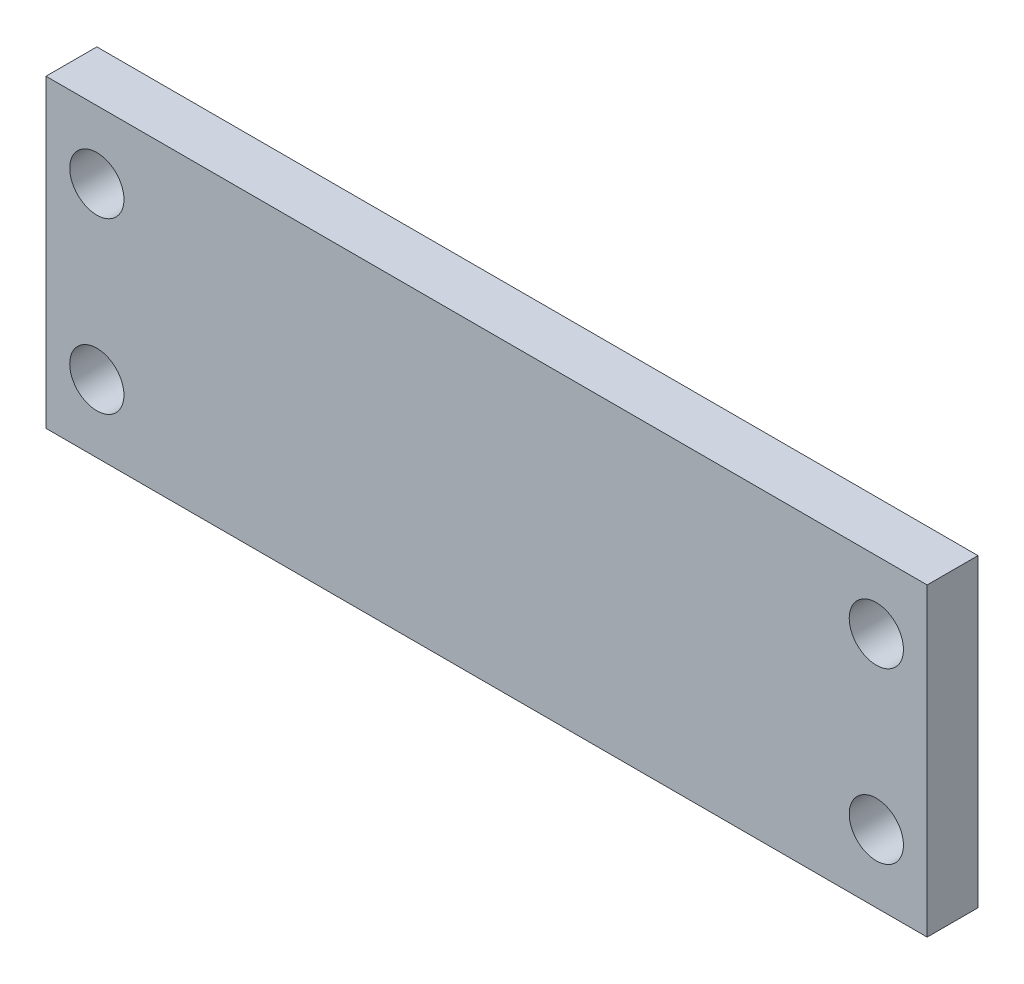
ISO-10303-21;
HEADER;
FILE_DESCRIPTION(('STEP AP214'),'2;1');
FILE_NAME('part.step','',(''),(''),'','','');
FILE_SCHEMA(('AUTOMOTIVE_DESIGN { 1 0 10303 214 1 1 1 1 }'));
ENDSEC;
DATA;
#1=APPLICATION_CONTEXT('core data for automotive mechanical design processes');
#2=APPLICATION_PROTOCOL_DEFINITION('international standard','automotive_design',2000,#1);
#3=PRODUCT_CONTEXT('',#1,'mechanical');
#4=PRODUCT('Part','Part','',(#3));
#5=PRODUCT_RELATED_PRODUCT_CATEGORY('part','',(#4));
#6=PRODUCT_DEFINITION_FORMATION('','',#4);
#7=PRODUCT_DEFINITION_CONTEXT('part definition',#1,'design');
#8=PRODUCT_DEFINITION('design','',#6,#7);
#9=PRODUCT_DEFINITION_SHAPE('','',#8);
#10=(LENGTH_UNIT() NAMED_UNIT(*) SI_UNIT(.MILLI.,.METRE.));
#11=(NAMED_UNIT(*) PLANE_ANGLE_UNIT() SI_UNIT($,.RADIAN.));
#12=(NAMED_UNIT(*) SI_UNIT($,.STERADIAN.) SOLID_ANGLE_UNIT());
#13=UNCERTAINTY_MEASURE_WITH_UNIT(LENGTH_MEASURE(1.E-05),#10,'distance_accuracy_value','');
#14=(GEOMETRIC_REPRESENTATION_CONTEXT(3) GLOBAL_UNCERTAINTY_ASSIGNED_CONTEXT((#13)) GLOBAL_UNIT_ASSIGNED_CONTEXT((#10,
#11,#12)) REPRESENTATION_CONTEXT('',''));
#15=CARTESIAN_POINT('',(0.,0.,0.));
#16=DIRECTION('',(0.,0.,1.));
#17=DIRECTION('',(1.,0.,0.));
#18=AXIS2_PLACEMENT_3D('',#15,#16,#17);
#19=CARTESIAN_POINT('',(0.,0.,3.));
#20=DIRECTION('',(0.,0.,-1.));
#21=DIRECTION('',(-1.,0.,0.));
#22=AXIS2_PLACEMENT_3D('',#19,#20,#21);
#23=PLANE('',#22);
#24=DIRECTION('',(0.,1.,0.));
#25=VECTOR('',#24,1.);
#26=CARTESIAN_POINT('',(26.,-9.,3.));
#27=LINE('',#26,#25);
#28=CARTESIAN_POINT('',(26.,-9.,3.));
#29=VERTEX_POINT('',#28);
#30=CARTESIAN_POINT('',(26.,9.,3.));
#31=VERTEX_POINT('',#30);
#32=EDGE_CURVE('E92',#29,#31,#27,.T.);
#33=ORIENTED_EDGE('',*,*,#32,.T.);
#34=DIRECTION('',(-1.,0.,0.));
#35=VECTOR('',#34,1.);
#36=CARTESIAN_POINT('',(-26.,9.,3.));
#37=LINE('',#36,#35);
#38=CARTESIAN_POINT('',(-26.,9.,3.));
#39=VERTEX_POINT('',#38);
#40=EDGE_CURVE('E87',#31,#39,#37,.T.);
#41=ORIENTED_EDGE('',*,*,#40,.T.);
#42=DIRECTION('',(0.,-1.,0.));
#43=VECTOR('',#42,1.);
#44=CARTESIAN_POINT('',(-26.,-9.,3.));
#45=LINE('',#44,#43);
#46=CARTESIAN_POINT('',(-26.,-9.,3.));
#47=VERTEX_POINT('',#46);
#48=EDGE_CURVE('E90',#39,#47,#45,.T.);
#49=ORIENTED_EDGE('',*,*,#48,.T.);
#50=DIRECTION('',(1.,0.,0.));
#51=VECTOR('',#50,1.);
#52=CARTESIAN_POINT('',(-26.,-9.,3.));
#53=LINE('',#52,#51);
#54=EDGE_CURVE('E57',#47,#29,#53,.T.);
#55=ORIENTED_EDGE('',*,*,#54,.T.);
#56=EDGE_LOOP('',(#33,#41,#49,#55));
#57=FACE_BOUND('',#56,.T.);
#58=CARTESIAN_POINT('',(23.,-4.99999999999999,3.));
#59=DIRECTION('',(0.,0.,1.));
#60=DIRECTION('',(1.,0.,0.));
#61=AXIS2_PLACEMENT_3D('',#58,#59,#60);
#62=CIRCLE('',#61,1.6);
#63=CARTESIAN_POINT('',(24.6,-4.99999999999999,3.));
#64=VERTEX_POINT('',#63);
#65=EDGE_CURVE('E112',#64,#64,#62,.T.);
#66=ORIENTED_EDGE('',*,*,#65,.F.);
#67=EDGE_LOOP('',(#66));
#68=FACE_BOUND('',#67,.T.);
#69=CARTESIAN_POINT('',(-23.,5.,3.));
#70=DIRECTION('',(0.,0.,1.));
#71=DIRECTION('',(1.,0.,0.));
#72=AXIS2_PLACEMENT_3D('',#69,#70,#71);
#73=CIRCLE('',#72,1.6);
#74=CARTESIAN_POINT('',(-21.4,5.,3.));
#75=VERTEX_POINT('',#74);
#76=EDGE_CURVE('E134',#75,#75,#73,.T.);
#77=ORIENTED_EDGE('',*,*,#76,.F.);
#78=EDGE_LOOP('',(#77));
#79=FACE_BOUND('',#78,.T.);
#80=CARTESIAN_POINT('',(23.,5.00000000000001,3.));
#81=DIRECTION('',(0.,0.,1.));
#82=DIRECTION('',(-1.,0.,0.));
#83=AXIS2_PLACEMENT_3D('',#80,#81,#82);
#84=CIRCLE('',#83,1.6);
#85=CARTESIAN_POINT('',(21.4,5.00000000000001,3.));
#86=VERTEX_POINT('',#85);
#87=EDGE_CURVE('E142',#86,#86,#84,.T.);
#88=ORIENTED_EDGE('',*,*,#87,.F.);
#89=EDGE_LOOP('',(#88));
#90=FACE_BOUND('',#89,.T.);
#91=CARTESIAN_POINT('',(-23.,-5.,3.));
#92=DIRECTION('',(0.,0.,1.));
#93=DIRECTION('',(-1.,0.,0.));
#94=AXIS2_PLACEMENT_3D('',#91,#92,#93);
#95=CIRCLE('',#94,1.6);
#96=CARTESIAN_POINT('',(-24.6,-5.,3.));
#97=VERTEX_POINT('',#96);
#98=EDGE_CURVE('E150',#97,#97,#95,.T.);
#99=ORIENTED_EDGE('',*,*,#98,.F.);
#100=EDGE_LOOP('',(#99));
#101=FACE_BOUND('',#100,.T.);
#102=ADVANCED_FACE('F39',(#57,#68,#79,#90,#101),#23,.F.);
#103=CARTESIAN_POINT('',(0.,0.,0.));
#104=DIRECTION('',(0.,0.,-1.));
#105=DIRECTION('',(-1.,0.,0.));
#106=AXIS2_PLACEMENT_3D('',#103,#104,#105);
#107=PLANE('',#106);
#108=CARTESIAN_POINT('',(23.,5.00000000000001,0.));
#109=DIRECTION('',(0.,0.,1.));
#110=DIRECTION('',(-1.,0.,0.));
#111=AXIS2_PLACEMENT_3D('',#108,#109,#110);
#112=CIRCLE('',#111,1.6);
#113=CARTESIAN_POINT('',(21.4,5.00000000000001,0.));
#114=VERTEX_POINT('',#113);
#115=EDGE_CURVE('E146',#114,#114,#112,.T.);
#116=ORIENTED_EDGE('',*,*,#115,.T.);
#117=EDGE_LOOP('',(#116));
#118=FACE_BOUND('',#117,.T.);
#119=CARTESIAN_POINT('',(23.,-4.99999999999999,0.));
#120=DIRECTION('',(0.,0.,1.));
#121=DIRECTION('',(1.,0.,0.));
#122=AXIS2_PLACEMENT_3D('',#119,#120,#121);
#123=CIRCLE('',#122,1.6);
#124=CARTESIAN_POINT('',(24.6,-4.99999999999999,0.));
#125=VERTEX_POINT('',#124);
#126=EDGE_CURVE('E130',#125,#125,#123,.T.);
#127=ORIENTED_EDGE('',*,*,#126,.T.);
#128=EDGE_LOOP('',(#127));
#129=FACE_BOUND('',#128,.T.);
#130=DIRECTION('',(0.,1.,0.));
#131=VECTOR('',#130,1.);
#132=CARTESIAN_POINT('',(26.,-9.,0.));
#133=LINE('',#132,#131);
#134=CARTESIAN_POINT('',(26.,-9.,0.));
#135=VERTEX_POINT('',#134);
#136=CARTESIAN_POINT('',(26.,9.,0.));
#137=VERTEX_POINT('',#136);
#138=EDGE_CURVE('E108',#135,#137,#133,.T.);
#139=ORIENTED_EDGE('',*,*,#138,.F.);
#140=DIRECTION('',(1.,0.,0.));
#141=VECTOR('',#140,1.);
#142=CARTESIAN_POINT('',(-26.,-9.,0.));
#143=LINE('',#142,#141);
#144=CARTESIAN_POINT('',(-26.,-9.,0.));
#145=VERTEX_POINT('',#144);
#146=EDGE_CURVE('E80',#145,#135,#143,.T.);
#147=ORIENTED_EDGE('',*,*,#146,.F.);
#148=DIRECTION('',(0.,-1.,0.));
#149=VECTOR('',#148,1.);
#150=CARTESIAN_POINT('',(-26.,-9.,0.));
#151=LINE('',#150,#149);
#152=CARTESIAN_POINT('',(-26.,9.,0.));
#153=VERTEX_POINT('',#152);
#154=EDGE_CURVE('E74',#153,#145,#151,.T.);
#155=ORIENTED_EDGE('',*,*,#154,.F.);
#156=DIRECTION('',(-1.,0.,0.));
#157=VECTOR('',#156,1.);
#158=CARTESIAN_POINT('',(-26.,9.,0.));
#159=LINE('',#158,#157);
#160=EDGE_CURVE('E97',#137,#153,#159,.T.);
#161=ORIENTED_EDGE('',*,*,#160,.F.);
#162=EDGE_LOOP('',(#139,#147,#155,#161));
#163=FACE_BOUND('',#162,.T.);
#164=CARTESIAN_POINT('',(-23.,5.,0.));
#165=DIRECTION('',(0.,0.,1.));
#166=DIRECTION('',(1.,0.,0.));
#167=AXIS2_PLACEMENT_3D('',#164,#165,#166);
#168=CIRCLE('',#167,1.6);
#169=CARTESIAN_POINT('',(-21.4,5.,0.));
#170=VERTEX_POINT('',#169);
#171=EDGE_CURVE('E138',#170,#170,#168,.T.);
#172=ORIENTED_EDGE('',*,*,#171,.T.);
#173=EDGE_LOOP('',(#172));
#174=FACE_BOUND('',#173,.T.);
#175=CARTESIAN_POINT('',(-23.,-5.,0.));
#176=DIRECTION('',(0.,0.,1.));
#177=DIRECTION('',(-1.,0.,0.));
#178=AXIS2_PLACEMENT_3D('',#175,#176,#177);
#179=CIRCLE('',#178,1.6);
#180=CARTESIAN_POINT('',(-24.6,-5.,0.));
#181=VERTEX_POINT('',#180);
#182=EDGE_CURVE('E154',#181,#181,#179,.T.);
#183=ORIENTED_EDGE('',*,*,#182,.T.);
#184=EDGE_LOOP('',(#183));
#185=FACE_BOUND('',#184,.T.);
#186=ADVANCED_FACE('F125',(#118,#129,#163,#174,#185),#107,.T.);
#187=CARTESIAN_POINT('',(26.,-9.,3.));
#188=DIRECTION('',(-1.,0.,0.));
#189=DIRECTION('',(0.,0.,1.));
#190=AXIS2_PLACEMENT_3D('',#187,#188,#189);
#191=PLANE('',#190);
#192=ORIENTED_EDGE('',*,*,#138,.T.);
#193=DIRECTION('',(0.,0.,-1.));
#194=VECTOR('',#193,1.);
#195=CARTESIAN_POINT('',(26.,9.,3.));
#196=LINE('',#195,#194);
#197=EDGE_CURVE('E11',#31,#137,#196,.T.);
#198=ORIENTED_EDGE('',*,*,#197,.F.);
#199=ORIENTED_EDGE('',*,*,#32,.F.);
#200=DIRECTION('',(0.,0.,-1.));
#201=VECTOR('',#200,1.);
#202=CARTESIAN_POINT('',(26.,-9.,3.));
#203=LINE('',#202,#201);
#204=EDGE_CURVE('E104',#29,#135,#203,.T.);
#205=ORIENTED_EDGE('',*,*,#204,.T.);
#206=EDGE_LOOP('',(#192,#198,#199,#205));
#207=FACE_BOUND('',#206,.T.);
#208=ADVANCED_FACE('F41',(#207),#191,.F.);
#209=CARTESIAN_POINT('',(-26.,9.,3.));
#210=DIRECTION('',(0.,-1.,0.));
#211=DIRECTION('',(0.,0.,-1.));
#212=AXIS2_PLACEMENT_3D('',#209,#210,#211);
#213=PLANE('',#212);
#214=ORIENTED_EDGE('',*,*,#160,.T.);
#215=DIRECTION('',(0.,0.,-1.));
#216=VECTOR('',#215,1.);
#217=CARTESIAN_POINT('',(-26.,9.,3.));
#218=LINE('',#217,#216);
#219=EDGE_CURVE('E49',#39,#153,#218,.T.);
#220=ORIENTED_EDGE('',*,*,#219,.F.);
#221=ORIENTED_EDGE('',*,*,#40,.F.);
#222=ORIENTED_EDGE('',*,*,#197,.T.);
#223=EDGE_LOOP('',(#214,#220,#221,#222));
#224=FACE_BOUND('',#223,.T.);
#225=ADVANCED_FACE('F96',(#224),#213,.F.);
#226=CARTESIAN_POINT('',(-26.,-9.,3.));
#227=DIRECTION('',(1.,0.,0.));
#228=DIRECTION('',(0.,0.,-1.));
#229=AXIS2_PLACEMENT_3D('',#226,#227,#228);
#230=PLANE('',#229);
#231=ORIENTED_EDGE('',*,*,#154,.T.);
#232=DIRECTION('',(0.,0.,-1.));
#233=VECTOR('',#232,1.);
#234=CARTESIAN_POINT('',(-26.,-9.,3.));
#235=LINE('',#234,#233);
#236=EDGE_CURVE('E99',#47,#145,#235,.T.);
#237=ORIENTED_EDGE('',*,*,#236,.F.);
#238=ORIENTED_EDGE('',*,*,#48,.F.);
#239=ORIENTED_EDGE('',*,*,#219,.T.);
#240=EDGE_LOOP('',(#231,#237,#238,#239));
#241=FACE_BOUND('',#240,.T.);
#242=ADVANCED_FACE('F100',(#241),#230,.F.);
#243=CARTESIAN_POINT('',(-26.,-9.,3.));
#244=DIRECTION('',(0.,1.,0.));
#245=DIRECTION('',(0.,0.,1.));
#246=AXIS2_PLACEMENT_3D('',#243,#244,#245);
#247=PLANE('',#246);
#248=ORIENTED_EDGE('',*,*,#146,.T.);
#249=ORIENTED_EDGE('',*,*,#204,.F.);
#250=ORIENTED_EDGE('',*,*,#54,.F.);
#251=ORIENTED_EDGE('',*,*,#236,.T.);
#252=EDGE_LOOP('',(#248,#249,#250,#251));
#253=FACE_BOUND('',#252,.T.);
#254=ADVANCED_FACE('F122',(#253),#247,.F.);
#255=CARTESIAN_POINT('',(23.,-4.99999999999999,3.));
#256=DIRECTION('',(0.,0.,-1.));
#257=DIRECTION('',(-1.,0.,0.));
#258=AXIS2_PLACEMENT_3D('',#255,#256,#257);
#259=CYLINDRICAL_SURFACE('',#258,1.6);
#260=ORIENTED_EDGE('',*,*,#65,.T.);
#261=EDGE_LOOP('',(#260));
#262=FACE_BOUND('',#261,.T.);
#263=ORIENTED_EDGE('',*,*,#126,.F.);
#264=EDGE_LOOP('',(#263));
#265=FACE_BOUND('',#264,.T.);
#266=ADVANCED_FACE('F173',(#262,#265),#259,.F.);
#267=CARTESIAN_POINT('',(-23.,5.,3.));
#268=DIRECTION('',(0.,0.,-1.));
#269=DIRECTION('',(-1.,0.,0.));
#270=AXIS2_PLACEMENT_3D('',#267,#268,#269);
#271=CYLINDRICAL_SURFACE('',#270,1.6);
#272=ORIENTED_EDGE('',*,*,#76,.T.);
#273=EDGE_LOOP('',(#272));
#274=FACE_BOUND('',#273,.T.);
#275=ORIENTED_EDGE('',*,*,#171,.F.);
#276=EDGE_LOOP('',(#275));
#277=FACE_BOUND('',#276,.T.);
#278=ADVANCED_FACE('F219',(#274,#277),#271,.F.);
#279=CARTESIAN_POINT('',(23.,5.00000000000001,3.));
#280=DIRECTION('',(0.,0.,-1.));
#281=DIRECTION('',(-1.,0.,0.));
#282=AXIS2_PLACEMENT_3D('',#279,#280,#281);
#283=CYLINDRICAL_SURFACE('',#282,1.6);
#284=ORIENTED_EDGE('',*,*,#87,.T.);
#285=EDGE_LOOP('',(#284));
#286=FACE_BOUND('',#285,.T.);
#287=ORIENTED_EDGE('',*,*,#115,.F.);
#288=EDGE_LOOP('',(#287));
#289=FACE_BOUND('',#288,.T.);
#290=ADVANCED_FACE('F227',(#286,#289),#283,.F.);
#291=CARTESIAN_POINT('',(-23.,-5.,3.));
#292=DIRECTION('',(0.,0.,-1.));
#293=DIRECTION('',(-1.,0.,0.));
#294=AXIS2_PLACEMENT_3D('',#291,#292,#293);
#295=CYLINDRICAL_SURFACE('',#294,1.6);
#296=ORIENTED_EDGE('',*,*,#98,.T.);
#297=EDGE_LOOP('',(#296));
#298=FACE_BOUND('',#297,.T.);
#299=ORIENTED_EDGE('',*,*,#182,.F.);
#300=EDGE_LOOP('',(#299));
#301=FACE_BOUND('',#300,.T.);
#302=ADVANCED_FACE('F162',(#298,#301),#295,.F.);
#303=CLOSED_SHELL('',(#102,#186,#208,#225,#242,#254,#266,#278,#290,#302));
#304=MANIFOLD_SOLID_BREP('B2',#303);
#305=ADVANCED_BREP_SHAPE_REPRESENTATION('',(#18,#304),#14);
#306=SHAPE_DEFINITION_REPRESENTATION(#9,#305);
ENDSEC;
END-ISO-10303-21;
